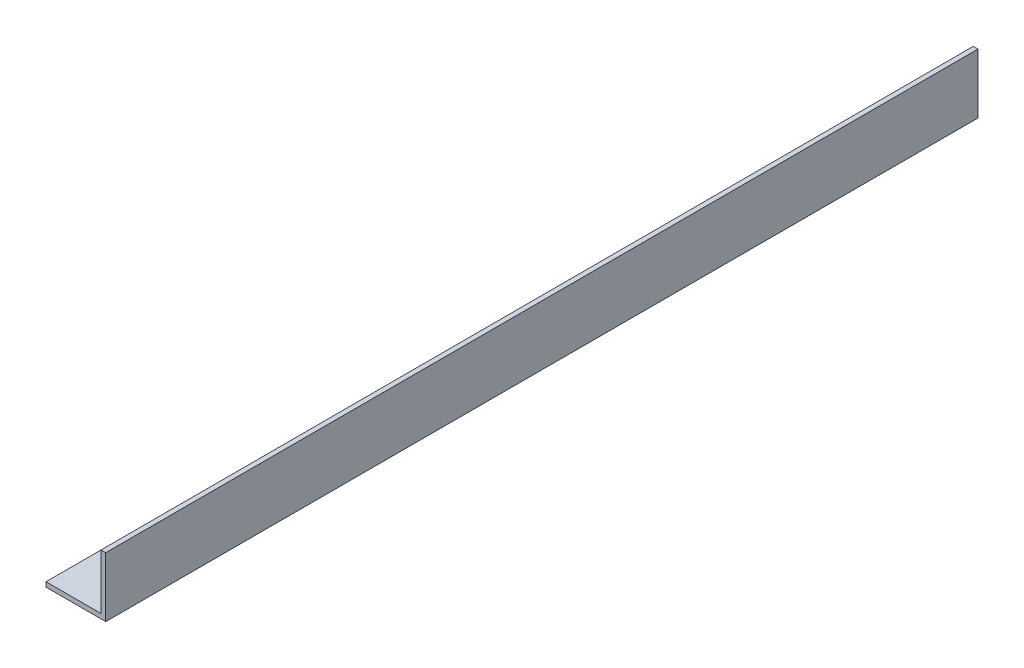
ISO-10303-21;
HEADER;
FILE_DESCRIPTION(('STEP AP214'),'2;1');
FILE_NAME('part.step','',(''),(''),'','','');
FILE_SCHEMA(('AUTOMOTIVE_DESIGN { 1 0 10303 214 1 1 1 1 }'));
ENDSEC;
DATA;
#1=APPLICATION_CONTEXT('core data for automotive mechanical design processes');
#2=APPLICATION_PROTOCOL_DEFINITION('international standard','automotive_design',2000,#1);
#3=PRODUCT_CONTEXT('',#1,'mechanical');
#4=PRODUCT('Part','Part','',(#3));
#5=PRODUCT_RELATED_PRODUCT_CATEGORY('part','',(#4));
#6=PRODUCT_DEFINITION_FORMATION('','',#4);
#7=PRODUCT_DEFINITION_CONTEXT('part definition',#1,'design');
#8=PRODUCT_DEFINITION('design','',#6,#7);
#9=PRODUCT_DEFINITION_SHAPE('','',#8);
#10=(LENGTH_UNIT() NAMED_UNIT(*) SI_UNIT(.MILLI.,.METRE.));
#11=(NAMED_UNIT(*) PLANE_ANGLE_UNIT() SI_UNIT($,.RADIAN.));
#12=(NAMED_UNIT(*) SI_UNIT($,.STERADIAN.) SOLID_ANGLE_UNIT());
#13=UNCERTAINTY_MEASURE_WITH_UNIT(LENGTH_MEASURE(1.E-05),#10,'distance_accuracy_value','');
#14=(GEOMETRIC_REPRESENTATION_CONTEXT(3) GLOBAL_UNCERTAINTY_ASSIGNED_CONTEXT((#13)) GLOBAL_UNIT_ASSIGNED_CONTEXT((#10,
#11,#12)) REPRESENTATION_CONTEXT('',''));
#15=CARTESIAN_POINT('',(0.,0.,0.));
#16=DIRECTION('',(0.,0.,1.));
#17=DIRECTION('',(1.,0.,0.));
#18=AXIS2_PLACEMENT_3D('',#15,#16,#17);
#19=CARTESIAN_POINT('',(0.,2.,371.));
#20=DIRECTION('',(0.,-1.,0.));
#21=DIRECTION('',(1.,0.,0.));
#22=AXIS2_PLACEMENT_3D('',#19,#20,#21);
#23=PLANE('',#22);
#24=DIRECTION('',(-1.,0.,0.));
#25=VECTOR('',#24,1.);
#26=CARTESIAN_POINT('',(0.,2.,0.));
#27=LINE('',#26,#25);
#28=CARTESIAN_POINT('',(-2.,2.,0.));
#29=VERTEX_POINT('',#28);
#30=CARTESIAN_POINT('',(-25.4,2.,0.));
#31=VERTEX_POINT('',#30);
#32=EDGE_CURVE('E113',#29,#31,#27,.T.);
#33=ORIENTED_EDGE('',*,*,#32,.T.);
#34=DIRECTION('',(0.,0.,-1.));
#35=VECTOR('',#34,1.);
#36=CARTESIAN_POINT('',(-25.4,2.,371.));
#37=LINE('',#36,#35);
#38=CARTESIAN_POINT('',(-25.4,2.,371.));
#39=VERTEX_POINT('',#38);
#40=EDGE_CURVE('E11',#39,#31,#37,.T.);
#41=ORIENTED_EDGE('',*,*,#40,.F.);
#42=DIRECTION('',(-1.,0.,0.));
#43=VECTOR('',#42,1.);
#44=CARTESIAN_POINT('',(0.,2.,371.));
#45=LINE('',#44,#43);
#46=CARTESIAN_POINT('',(-2.,2.,371.));
#47=VERTEX_POINT('',#46);
#48=EDGE_CURVE('E78',#47,#39,#45,.T.);
#49=ORIENTED_EDGE('',*,*,#48,.F.);
#50=DIRECTION('',(0.,0.,-1.));
#51=VECTOR('',#50,1.);
#52=CARTESIAN_POINT('',(-2.,2.,371.));
#53=LINE('',#52,#51);
#54=EDGE_CURVE('E109',#47,#29,#53,.T.);
#55=ORIENTED_EDGE('',*,*,#54,.T.);
#56=EDGE_LOOP('',(#33,#41,#49,#55));
#57=FACE_BOUND('',#56,.T.);
#58=ADVANCED_FACE('F32',(#57),#23,.F.);
#59=CARTESIAN_POINT('',(-25.4,0.,371.));
#60=DIRECTION('',(-1.,0.,0.));
#61=DIRECTION('',(0.,0.,1.));
#62=AXIS2_PLACEMENT_3D('',#59,#60,#61);
#63=PLANE('',#62);
#64=DIRECTION('',(0.,1.,0.));
#65=VECTOR('',#64,1.);
#66=CARTESIAN_POINT('',(-25.4,0.,0.));
#67=LINE('',#66,#65);
#68=CARTESIAN_POINT('',(-25.4,0.,0.));
#69=VERTEX_POINT('',#68);
#70=EDGE_CURVE('E116',#69,#31,#67,.T.);
#71=ORIENTED_EDGE('',*,*,#70,.F.);
#72=DIRECTION('',(0.,0.,-1.));
#73=VECTOR('',#72,1.);
#74=CARTESIAN_POINT('',(-25.4,0.,371.));
#75=LINE('',#74,#73);
#76=CARTESIAN_POINT('',(-25.4,0.,371.));
#77=VERTEX_POINT('',#76);
#78=EDGE_CURVE('E40',#77,#69,#75,.T.);
#79=ORIENTED_EDGE('',*,*,#78,.F.);
#80=DIRECTION('',(0.,1.,0.));
#81=VECTOR('',#80,1.);
#82=CARTESIAN_POINT('',(-25.4,0.,371.));
#83=LINE('',#82,#81);
#84=EDGE_CURVE('E202',#77,#39,#83,.T.);
#85=ORIENTED_EDGE('',*,*,#84,.T.);
#86=ORIENTED_EDGE('',*,*,#40,.T.);
#87=EDGE_LOOP('',(#71,#79,#85,#86));
#88=FACE_BOUND('',#87,.T.);
#89=ADVANCED_FACE('F134',(#88),#63,.T.);
#90=CARTESIAN_POINT('',(0.,0.,371.));
#91=DIRECTION('',(0.,-1.,0.));
#92=DIRECTION('',(1.,0.,0.));
#93=AXIS2_PLACEMENT_3D('',#90,#91,#92);
#94=PLANE('',#93);
#95=DIRECTION('',(-1.,0.,0.));
#96=VECTOR('',#95,1.);
#97=CARTESIAN_POINT('',(0.,0.,0.));
#98=LINE('',#97,#96);
#99=CARTESIAN_POINT('',(0.,0.,0.));
#100=VERTEX_POINT('',#99);
#101=EDGE_CURVE('E119',#100,#69,#98,.T.);
#102=ORIENTED_EDGE('',*,*,#101,.F.);
#103=DIRECTION('',(0.,0.,-1.));
#104=VECTOR('',#103,1.);
#105=CARTESIAN_POINT('',(0.,0.,371.));
#106=LINE('',#105,#104);
#107=CARTESIAN_POINT('',(0.,0.,371.));
#108=VERTEX_POINT('',#107);
#109=EDGE_CURVE('E99',#108,#100,#106,.T.);
#110=ORIENTED_EDGE('',*,*,#109,.F.);
#111=DIRECTION('',(-1.,0.,0.));
#112=VECTOR('',#111,1.);
#113=CARTESIAN_POINT('',(0.,0.,371.));
#114=LINE('',#113,#112);
#115=EDGE_CURVE('E105',#108,#77,#114,.T.);
#116=ORIENTED_EDGE('',*,*,#115,.T.);
#117=ORIENTED_EDGE('',*,*,#78,.T.);
#118=EDGE_LOOP('',(#102,#110,#116,#117));
#119=FACE_BOUND('',#118,.T.);
#120=ADVANCED_FACE('F131',(#119),#94,.T.);
#121=CARTESIAN_POINT('',(0.,25.4,371.));
#122=DIRECTION('',(1.,0.,0.));
#123=DIRECTION('',(0.,0.,-1.));
#124=AXIS2_PLACEMENT_3D('',#121,#122,#123);
#125=PLANE('',#124);
#126=DIRECTION('',(0.,-1.,0.));
#127=VECTOR('',#126,1.);
#128=CARTESIAN_POINT('',(0.,25.4,0.));
#129=LINE('',#128,#127);
#130=CARTESIAN_POINT('',(0.,25.4,0.));
#131=VERTEX_POINT('',#130);
#132=EDGE_CURVE('E94',#131,#100,#129,.T.);
#133=ORIENTED_EDGE('',*,*,#132,.F.);
#134=DIRECTION('',(0.,0.,-1.));
#135=VECTOR('',#134,1.);
#136=CARTESIAN_POINT('',(0.,25.4,371.));
#137=LINE('',#136,#135);
#138=CARTESIAN_POINT('',(0.,25.4,371.));
#139=VERTEX_POINT('',#138);
#140=EDGE_CURVE('E89',#139,#131,#137,.T.);
#141=ORIENTED_EDGE('',*,*,#140,.F.);
#142=DIRECTION('',(0.,-1.,0.));
#143=VECTOR('',#142,1.);
#144=CARTESIAN_POINT('',(0.,25.4,371.));
#145=LINE('',#144,#143);
#146=EDGE_CURVE('E92',#139,#108,#145,.T.);
#147=ORIENTED_EDGE('',*,*,#146,.T.);
#148=ORIENTED_EDGE('',*,*,#109,.T.);
#149=EDGE_LOOP('',(#133,#141,#147,#148));
#150=FACE_BOUND('',#149,.T.);
#151=ADVANCED_FACE('F91',(#150),#125,.T.);
#152=CARTESIAN_POINT('',(-2.,25.4,371.));
#153=DIRECTION('',(0.,1.,0.));
#154=DIRECTION('',(0.,0.,1.));
#155=AXIS2_PLACEMENT_3D('',#152,#153,#154);
#156=PLANE('',#155);
#157=DIRECTION('',(1.,0.,0.));
#158=VECTOR('',#157,1.);
#159=CARTESIAN_POINT('',(-2.,25.4,0.));
#160=LINE('',#159,#158);
#161=CARTESIAN_POINT('',(-2.,25.4,0.));
#162=VERTEX_POINT('',#161);
#163=EDGE_CURVE('E123',#162,#131,#160,.T.);
#164=ORIENTED_EDGE('',*,*,#163,.F.);
#165=DIRECTION('',(0.,0.,-1.));
#166=VECTOR('',#165,1.);
#167=CARTESIAN_POINT('',(-2.,25.4,371.));
#168=LINE('',#167,#166);
#169=CARTESIAN_POINT('',(-2.,25.4,371.));
#170=VERTEX_POINT('',#169);
#171=EDGE_CURVE('E69',#170,#162,#168,.T.);
#172=ORIENTED_EDGE('',*,*,#171,.F.);
#173=DIRECTION('',(1.,0.,0.));
#174=VECTOR('',#173,1.);
#175=CARTESIAN_POINT('',(-2.,25.4,371.));
#176=LINE('',#175,#174);
#177=EDGE_CURVE('E103',#170,#139,#176,.T.);
#178=ORIENTED_EDGE('',*,*,#177,.T.);
#179=ORIENTED_EDGE('',*,*,#140,.T.);
#180=EDGE_LOOP('',(#164,#172,#178,#179));
#181=FACE_BOUND('',#180,.T.);
#182=ADVANCED_FACE('F107',(#181),#156,.T.);
#183=CARTESIAN_POINT('',(-2.,25.4,371.));
#184=DIRECTION('',(1.,0.,0.));
#185=DIRECTION('',(0.,0.,-1.));
#186=AXIS2_PLACEMENT_3D('',#183,#184,#185);
#187=PLANE('',#186);
#188=DIRECTION('',(0.,1.,0.));
#189=VECTOR('',#188,1.);
#190=CARTESIAN_POINT('',(-2.,25.4,0.));
#191=LINE('',#190,#189);
#192=EDGE_CURVE('E72',#162,#29,#191,.F.);
#193=ORIENTED_EDGE('',*,*,#192,.T.);
#194=ORIENTED_EDGE('',*,*,#54,.F.);
#195=DIRECTION('',(0.,1.,0.));
#196=VECTOR('',#195,1.);
#197=CARTESIAN_POINT('',(-2.,25.4,371.));
#198=LINE('',#197,#196);
#199=EDGE_CURVE('E48',#170,#47,#198,.F.);
#200=ORIENTED_EDGE('',*,*,#199,.F.);
#201=ORIENTED_EDGE('',*,*,#171,.T.);
#202=EDGE_LOOP('',(#193,#194,#200,#201));
#203=FACE_BOUND('',#202,.T.);
#204=ADVANCED_FACE('F139',(#203),#187,.F.);
#205=CARTESIAN_POINT('',(0.,0.,371.));
#206=DIRECTION('',(0.,0.,-1.));
#207=DIRECTION('',(-1.,0.,0.));
#208=AXIS2_PLACEMENT_3D('',#205,#206,#207);
#209=PLANE('',#208);
#210=ORIENTED_EDGE('',*,*,#48,.T.);
#211=ORIENTED_EDGE('',*,*,#84,.F.);
#212=ORIENTED_EDGE('',*,*,#115,.F.);
#213=ORIENTED_EDGE('',*,*,#146,.F.);
#214=ORIENTED_EDGE('',*,*,#177,.F.);
#215=ORIENTED_EDGE('',*,*,#199,.T.);
#216=EDGE_LOOP('',(#210,#211,#212,#213,#214,#215));
#217=FACE_BOUND('',#216,.T.);
#218=ADVANCED_FACE('F102',(#217),#209,.F.);
#219=CARTESIAN_POINT('',(0.,0.,0.));
#220=DIRECTION('',(0.,0.,-1.));
#221=DIRECTION('',(-1.,0.,0.));
#222=AXIS2_PLACEMENT_3D('',#219,#220,#221);
#223=PLANE('',#222);
#224=ORIENTED_EDGE('',*,*,#32,.F.);
#225=ORIENTED_EDGE('',*,*,#192,.F.);
#226=ORIENTED_EDGE('',*,*,#163,.T.);
#227=ORIENTED_EDGE('',*,*,#132,.T.);
#228=ORIENTED_EDGE('',*,*,#101,.T.);
#229=ORIENTED_EDGE('',*,*,#70,.T.);
#230=EDGE_LOOP('',(#224,#225,#226,#227,#228,#229));
#231=FACE_BOUND('',#230,.T.);
#232=ADVANCED_FACE('F137',(#231),#223,.T.);
#233=CLOSED_SHELL('',(#58,#89,#120,#151,#182,#204,#218,#232));
#234=MANIFOLD_SOLID_BREP('B2',#233);
#235=ADVANCED_BREP_SHAPE_REPRESENTATION('',(#18,#234),#14);
#236=SHAPE_DEFINITION_REPRESENTATION(#9,#235);
ENDSEC;
END-ISO-10303-21;
